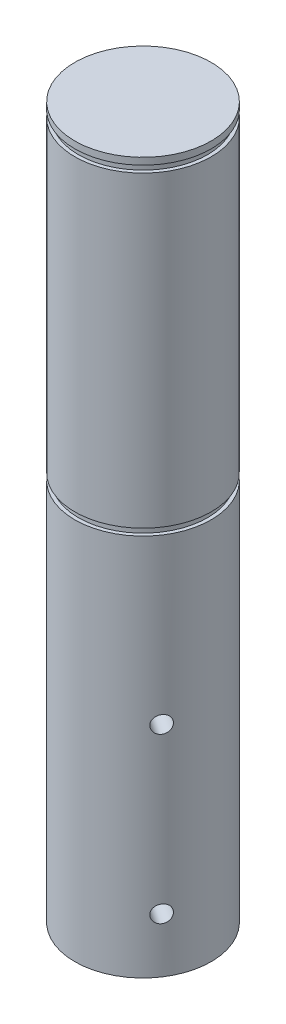
ISO-10303-21;
HEADER;
FILE_DESCRIPTION(('STEP AP214'),'2;1');
FILE_NAME('part.step','',(''),(''),'','','');
FILE_SCHEMA(('AUTOMOTIVE_DESIGN { 1 0 10303 214 1 1 1 1 }'));
ENDSEC;
DATA;
#1=APPLICATION_CONTEXT('core data for automotive mechanical design processes');
#2=APPLICATION_PROTOCOL_DEFINITION('international standard','automotive_design',2000,#1);
#3=PRODUCT_CONTEXT('',#1,'mechanical');
#4=PRODUCT('Part','Part','',(#3));
#5=PRODUCT_RELATED_PRODUCT_CATEGORY('part','',(#4));
#6=PRODUCT_DEFINITION_FORMATION('','',#4);
#7=PRODUCT_DEFINITION_CONTEXT('part definition',#1,'design');
#8=PRODUCT_DEFINITION('design','',#6,#7);
#9=PRODUCT_DEFINITION_SHAPE('','',#8);
#10=(LENGTH_UNIT() NAMED_UNIT(*) SI_UNIT(.MILLI.,.METRE.));
#11=(NAMED_UNIT(*) PLANE_ANGLE_UNIT() SI_UNIT($,.RADIAN.));
#12=(NAMED_UNIT(*) SI_UNIT($,.STERADIAN.) SOLID_ANGLE_UNIT());
#13=UNCERTAINTY_MEASURE_WITH_UNIT(LENGTH_MEASURE(1.E-05),#10,'distance_accuracy_value','');
#14=(GEOMETRIC_REPRESENTATION_CONTEXT(3) GLOBAL_UNCERTAINTY_ASSIGNED_CONTEXT((#13)) GLOBAL_UNIT_ASSIGNED_CONTEXT((#10,
#11,#12)) REPRESENTATION_CONTEXT('',''));
#15=CARTESIAN_POINT('',(0.,0.,0.));
#16=DIRECTION('',(0.,0.,1.));
#17=DIRECTION('',(1.,0.,0.));
#18=AXIS2_PLACEMENT_3D('',#15,#16,#17);
#19=CARTESIAN_POINT('',(5.9,40.,0.));
#20=DIRECTION('',(0.,-1.,0.));
#21=DIRECTION('',(0.,0.,-1.));
#22=AXIS2_PLACEMENT_3D('',#19,#20,#21);
#23=CYLINDRICAL_SURFACE('',#22,9.975);
#24=CARTESIAN_POINT('',(14.8208800148696,32.,4.46301745014509));
#25=CARTESIAN_POINT('',(14.8208791993844,31.9300833414179,4.46302047980772));
#26=CARTESIAN_POINT('',(14.8182302361782,31.8601230204867,4.46832614348333));
#27=CARTESIAN_POINT('',(14.8076533375949,31.7221494896786,4.48937305059214));
#28=CARTESIAN_POINT('',(14.7997198900633,31.6541383903444,4.50512519048948));
#29=CARTESIAN_POINT('',(14.7786586752671,31.5220809048803,4.54649099625896));
#30=CARTESIAN_POINT('',(14.7655344385593,31.4580318580989,4.57209795897621));
#31=CARTESIAN_POINT('',(14.7342392393183,31.3356510610332,4.63227663978951));
#32=CARTESIAN_POINT('',(14.7160691375806,31.2773183378714,4.66684682874429));
#33=CARTESIAN_POINT('',(14.6748010507614,31.1676860877441,4.74398660986875));
#34=CARTESIAN_POINT('',(14.6516787721996,31.1164233589458,4.78659550946792));
#35=CARTESIAN_POINT('',(14.6008923918793,31.0227041303424,4.8783028224304));
#36=CARTESIAN_POINT('',(14.5732280640231,30.9802480691608,4.92740155882611));
#37=CARTESIAN_POINT('',(14.513726980632,30.9052153336054,5.03069491021766));
#38=CARTESIAN_POINT('',(14.4818766623047,30.8726719656389,5.08490592059227));
#39=CARTESIAN_POINT('',(14.4147168090643,30.8186017408368,5.1965818937331));
#40=CARTESIAN_POINT('',(14.3794074032142,30.7970744731625,5.25404673506092));
#41=CARTESIAN_POINT('',(14.3063491094891,30.7657574838292,5.37015804219123));
#42=CARTESIAN_POINT('',(14.2686140392421,30.7559065813251,5.42879669699895));
#43=CARTESIAN_POINT('',(14.1915345026907,30.7480323410411,5.54580810503642));
#44=CARTESIAN_POINT('',(14.1521901000596,30.7500085357699,5.60418086868482));
#45=CARTESIAN_POINT('',(14.073262501895,30.7656833698157,5.71867243562648));
#46=CARTESIAN_POINT('',(14.0336818827281,30.7793162101421,5.77480204296756));
#47=CARTESIAN_POINT('',(13.9552979165347,30.8178144869098,5.88364695592406));
#48=CARTESIAN_POINT('',(13.9164945843622,30.8426801377962,5.93636219633394));
#49=CARTESIAN_POINT('',(13.8408474144264,30.903008133759,6.03718098798724));
#50=CARTESIAN_POINT('',(13.8040091577055,30.9384989449637,6.08527168637536));
#51=CARTESIAN_POINT('',(13.7336909453828,31.0190490982288,6.1755315282443));
#52=CARTESIAN_POINT('',(13.7002111446756,31.0641088813192,6.21770039864174));
#53=CARTESIAN_POINT('',(13.6376201129833,31.1628864004973,6.29542471065586));
#54=CARTESIAN_POINT('',(13.6085404691477,31.2166614816039,6.33093273532519));
#55=CARTESIAN_POINT('',(13.5561566033364,31.3311461501859,6.39418352642242));
#56=CARTESIAN_POINT('',(13.5328523996282,31.3918557595943,6.42192626828889));
#57=CARTESIAN_POINT('',(13.4929574291406,31.5185370312003,6.46904790213366));
#58=CARTESIAN_POINT('',(13.4763695399485,31.5845109344103,6.48842320934279));
#59=CARTESIAN_POINT('',(13.4506253344829,31.7198215917879,6.5183644831425));
#60=CARTESIAN_POINT('',(13.4414686581993,31.7891581828753,6.52893087648737));
#61=CARTESIAN_POINT('',(13.4310206446281,31.9287227652017,6.54097984256913));
#62=CARTESIAN_POINT('',(13.4296764111407,31.9989415277933,6.54252350647777));
#63=CARTESIAN_POINT('',(13.4347700841093,32.1387182250505,6.53665658257985));
#64=CARTESIAN_POINT('',(13.4412078238393,32.2082761738416,6.52924618661072));
#65=CARTESIAN_POINT('',(13.4615513137661,32.3445163480421,6.50567485092267));
#66=CARTESIAN_POINT('',(13.4754316751411,32.4112075222375,6.48954365869661));
#67=CARTESIAN_POINT('',(13.5100610922478,32.5401010131235,6.44889942451443));
#68=CARTESIAN_POINT('',(13.5308103904512,32.6023031712586,6.42438608666971));
#69=CARTESIAN_POINT('',(13.5784646689827,32.7208156946304,6.36735332352047));
#70=CARTESIAN_POINT('',(13.6054017314318,32.7770930421168,6.33479210252232));
#71=CARTESIAN_POINT('',(13.6643162510314,32.8818215184391,6.26244273476337));
#72=CARTESIAN_POINT('',(13.6962939052382,32.9302723411557,6.22265430545356));
#73=CARTESIAN_POINT('',(13.7642897817733,33.0182541864652,6.13649690382621));
#74=CARTESIAN_POINT('',(13.8003301048064,33.0577325125455,6.09009153441971));
#75=CARTESIAN_POINT('',(13.8749988187086,33.1262840624968,5.99197913132436));
#76=CARTESIAN_POINT('',(13.9136271571691,33.1553574969964,5.94027220498347));
#77=CARTESIAN_POINT('',(13.992035749931,33.2021869895519,5.83300781272822));
#78=CARTESIAN_POINT('',(14.0318126013097,33.2199734840143,5.77746115405297));
#79=CARTESIAN_POINT('',(14.1113271880816,33.2438232085716,5.66387975621307));
#80=CARTESIAN_POINT('',(14.1510649251663,33.2498869701024,5.60584512995935));
#81=CARTESIAN_POINT('',(14.2290333708309,33.2501091344703,5.48932682533169));
#82=CARTESIAN_POINT('',(14.2672725364822,33.2443487863141,5.43084894418217));
#83=CARTESIAN_POINT('',(14.3414920601411,33.2212583515877,5.31475167818921));
#84=CARTESIAN_POINT('',(14.3774724197746,33.203928273346,5.25713229272782));
#85=CARTESIAN_POINT('',(14.4462945916468,33.1582158661868,5.14449530773208));
#86=CARTESIAN_POINT('',(14.479137509531,33.1298374487699,5.08947679511937));
#87=CARTESIAN_POINT('',(14.5410144873016,33.0628423428094,4.9836987323979));
#88=CARTESIAN_POINT('',(14.5700485009802,33.0242255300756,4.93293923396016));
#89=CARTESIAN_POINT('',(14.6239691711517,32.9375492979116,4.83694558729285));
#90=CARTESIAN_POINT('',(14.648827286132,32.8894294282882,4.79174998650759));
#91=CARTESIAN_POINT('',(14.6937878582072,32.7852385867877,4.7087317855333));
#92=CARTESIAN_POINT('',(14.7138891875777,32.7291657344704,4.6709109341012));
#93=CARTESIAN_POINT('',(14.749133941208,32.6104109960841,4.60379197271577));
#94=CARTESIAN_POINT('',(14.7642578219954,32.5477043060522,4.57452750758825));
#95=CARTESIAN_POINT('',(14.7892520586603,32.4176726857271,4.52576847346693));
#96=CARTESIAN_POINT('',(14.7991281259017,32.3503528665412,4.5062632844959));
#97=CARTESIAN_POINT('',(14.811176688327,32.2355709802675,4.48237264869644));
#98=CARTESIAN_POINT('',(14.8148131773922,32.1888327428218,4.47512688686462));
#99=CARTESIAN_POINT('',(14.8196651077165,32.0947363502476,4.46544827946795));
#100=CARTESIAN_POINT('',(14.8208805674736,32.0473781998584,4.4630153971299));
#101=CARTESIAN_POINT('',(14.8208800148696,32.,4.46301745014509));
#102=B_SPLINE_CURVE_WITH_KNOTS('',3,(#24,#25,#26,#27,#28,#29,#30,#31,#32,#33,#34,#35,#36,#37,
#38,#39,#40,#41,#42,#43,#44,#45,#46,#47,#48,#49,#50,#51,#52,#53,#54,#55,#56,#57,#58,#59,#60,#61,
#62,#63,#64,#65,#66,#67,#68,#69,#70,#71,#72,#73,#74,#75,#76,#77,#78,#79,#80,#81,#82,#83,#84,#85,
#86,#87,#88,#89,#90,#91,#92,#93,#94,#95,#96,#97,#98,#99,#100,#101),.UNSPECIFIED.,.T.,.F.,(4,2,2,
2,2,2,2,2,2,2,2,2,2,2,2,2,2,2,2,2,2,2,2,2,2,2,2,2,2,2,2,2,2,2,2,2,2,2,4),(0.,0.209576893950373,
0.419372736994426,0.629026130436621,0.838643780169881,1.04931430241201,1.25999531475615,
1.47137659408023,1.68274998949545,1.89301088214847,2.1032634638445,2.31233699613348,
2.52141452000644,2.73105727909714,2.9407097026304,3.1518022182976,3.36289540163882,
3.57407893184075,3.78525223050708,3.9949940437514,4.20473136343457,4.41375772154063,
4.62279145901034,4.83293447881054,5.04308571595898,5.25444101494126,5.46579203516542,
5.67657067602573,5.88733976126652,6.09666540227375,6.30599089259875,6.51524234163157,
6.72449632896824,6.93512696888195,7.14580749456507,7.35730563319072,7.56857311770126,
7.71059151554433,7.85260882828005),.UNSPECIFIED.);
#103=CARTESIAN_POINT('',(14.8208800148696,32.,4.46301745014509));
#104=VERTEX_POINT('',#103);
#105=EDGE_CURVE('E11',#104,#104,#102,.T.);
#106=ORIENTED_EDGE('',*,*,#105,.T.);
#107=EDGE_LOOP('',(#106));
#108=FACE_BOUND('',#107,.T.);
#109=CARTESIAN_POINT('',(14.8208800148696,8.,4.46301745014509));
#110=CARTESIAN_POINT('',(14.8208791993844,7.9300833414179,4.46302047980772));
#111=CARTESIAN_POINT('',(14.8182302361782,7.86012302048667,4.46832614348333));
#112=CARTESIAN_POINT('',(14.8076533375949,7.72214948967865,4.48937305059214));
#113=CARTESIAN_POINT('',(14.7997198900633,7.65413839034441,4.50512519048948));
#114=CARTESIAN_POINT('',(14.7786586752671,7.52208090488033,4.54649099625895));
#115=CARTESIAN_POINT('',(14.7655344385593,7.4580318580989,4.57209795897621));
#116=CARTESIAN_POINT('',(14.7342392393183,7.33565106103318,4.6322766397895));
#117=CARTESIAN_POINT('',(14.7160691375806,7.27731833787137,4.66684682874429));
#118=CARTESIAN_POINT('',(14.6748010507614,7.16768608774415,4.74398660986875));
#119=CARTESIAN_POINT('',(14.6516787721996,7.11642335894578,4.78659550946792));
#120=CARTESIAN_POINT('',(14.6008923918793,7.02270413034242,4.87830282243039));
#121=CARTESIAN_POINT('',(14.5732280640231,6.98024806916079,4.92740155882611));
#122=CARTESIAN_POINT('',(14.513726980632,6.90521533360536,5.03069491021766));
#123=CARTESIAN_POINT('',(14.4818766623047,6.87267196563892,5.08490592059227));
#124=CARTESIAN_POINT('',(14.4147168090643,6.81860174083684,5.19658189373309));
#125=CARTESIAN_POINT('',(14.3794074032142,6.79707447316253,5.25404673506092));
#126=CARTESIAN_POINT('',(14.3063491094891,6.7657574838292,5.37015804219123));
#127=CARTESIAN_POINT('',(14.2686140392421,6.75590658132508,5.42879669699894));
#128=CARTESIAN_POINT('',(14.1915345026907,6.74803234104109,5.54580810503642));
#129=CARTESIAN_POINT('',(14.1521901000596,6.75000853576988,5.60418086868481));
#130=CARTESIAN_POINT('',(14.073262501895,6.76568336981567,5.71867243562647));
#131=CARTESIAN_POINT('',(14.0336818827281,6.77931621014213,5.77480204296756));
#132=CARTESIAN_POINT('',(13.9552979165347,6.81781448690983,5.88364695592406));
#133=CARTESIAN_POINT('',(13.9164945843622,6.84268013779624,5.93636219633394));
#134=CARTESIAN_POINT('',(13.8408474144264,6.90300813375903,6.03718098798724));
#135=CARTESIAN_POINT('',(13.8040091577055,6.93849894496366,6.08527168637536));
#136=CARTESIAN_POINT('',(13.7336909453828,7.01904909822883,6.1755315282443));
#137=CARTESIAN_POINT('',(13.7002111446756,7.06410888131917,6.21770039864174));
#138=CARTESIAN_POINT('',(13.6376201129833,7.16288640049734,6.29542471065586));
#139=CARTESIAN_POINT('',(13.6085404691477,7.21666148160393,6.33093273532519));
#140=CARTESIAN_POINT('',(13.5561566033364,7.33114615018593,6.39418352642242));
#141=CARTESIAN_POINT('',(13.5328523996282,7.39185575959426,6.42192626828889));
#142=CARTESIAN_POINT('',(13.4929574291406,7.5185370312003,6.46904790213366));
#143=CARTESIAN_POINT('',(13.4763695399485,7.58451093441035,6.48842320934279));
#144=CARTESIAN_POINT('',(13.4506253344829,7.71982159178788,6.5183644831425));
#145=CARTESIAN_POINT('',(13.4414686581993,7.78915818287526,6.52893087648737));
#146=CARTESIAN_POINT('',(13.4310206446281,7.92872276520167,6.54097984256913));
#147=CARTESIAN_POINT('',(13.4296764111407,7.99894152779329,6.54252350647777));
#148=CARTESIAN_POINT('',(13.4347700841093,8.13871822505048,6.53665658257985));
#149=CARTESIAN_POINT('',(13.4412078238393,8.20827617384158,6.52924618661072));
#150=CARTESIAN_POINT('',(13.4615513137661,8.34451634804212,6.50567485092267));
#151=CARTESIAN_POINT('',(13.4754316751411,8.41120752223746,6.48954365869661));
#152=CARTESIAN_POINT('',(13.5100610922478,8.54010101312347,6.44889942451443));
#153=CARTESIAN_POINT('',(13.5308103904512,8.60230317125861,6.42438608666971));
#154=CARTESIAN_POINT('',(13.5784646689827,8.72081569463042,6.36735332352048));
#155=CARTESIAN_POINT('',(13.6054017314318,8.77709304211681,6.33479210252232));
#156=CARTESIAN_POINT('',(13.6643162510314,8.88182151843913,6.26244273476337));
#157=CARTESIAN_POINT('',(13.6962939052382,8.93027234115569,6.22265430545356));
#158=CARTESIAN_POINT('',(13.7642897817733,9.01825418646524,6.13649690382621));
#159=CARTESIAN_POINT('',(13.8003301048064,9.05773251254554,6.09009153441971));
#160=CARTESIAN_POINT('',(13.8749988187086,9.12628406249678,5.99197913132437));
#161=CARTESIAN_POINT('',(13.9136271571691,9.15535749699644,5.94027220498348));
#162=CARTESIAN_POINT('',(13.992035749931,9.2021869895519,5.83300781272822));
#163=CARTESIAN_POINT('',(14.0318126013097,9.21997348401435,5.77746115405297));
#164=CARTESIAN_POINT('',(14.1113271880816,9.24382320857161,5.66387975621307));
#165=CARTESIAN_POINT('',(14.1510649251663,9.24988697010239,5.60584512995935));
#166=CARTESIAN_POINT('',(14.2290333708309,9.2501091344703,5.4893268253317));
#167=CARTESIAN_POINT('',(14.2672725364822,9.24434878631406,5.43084894418217));
#168=CARTESIAN_POINT('',(14.3414920601411,9.22125835158772,5.31475167818921));
#169=CARTESIAN_POINT('',(14.3774724197746,9.20392827334604,5.25713229272782));
#170=CARTESIAN_POINT('',(14.4462945916468,9.1582158661868,5.14449530773208));
#171=CARTESIAN_POINT('',(14.479137509531,9.12983744876986,5.08947679511937));
#172=CARTESIAN_POINT('',(14.5410144873016,9.06284234280936,4.9836987323979));
#173=CARTESIAN_POINT('',(14.5700485009802,9.02422553007565,4.93293923396016));
#174=CARTESIAN_POINT('',(14.6239691711517,8.93754929791162,4.83694558729285));
#175=CARTESIAN_POINT('',(14.648827286132,8.88942942828818,4.79174998650759));
#176=CARTESIAN_POINT('',(14.6937878582072,8.78523858678765,4.7087317855333));
#177=CARTESIAN_POINT('',(14.7138891875777,8.72916573447037,4.6709109341012));
#178=CARTESIAN_POINT('',(14.749133941208,8.61041099608409,4.60379197271577));
#179=CARTESIAN_POINT('',(14.7642578219954,8.5477043060522,4.57452750758825));
#180=CARTESIAN_POINT('',(14.7892520586603,8.41767268572709,4.52576847346693));
#181=CARTESIAN_POINT('',(14.7991281259017,8.35035286654118,4.5062632844959));
#182=CARTESIAN_POINT('',(14.811176688327,8.2355709802675,4.48237264869644));
#183=CARTESIAN_POINT('',(14.8148131773922,8.18883274282181,4.47512688686462));
#184=CARTESIAN_POINT('',(14.8196651077165,8.09473635024763,4.46544827946795));
#185=CARTESIAN_POINT('',(14.8208805674736,8.04737819985843,4.4630153971299));
#186=CARTESIAN_POINT('',(14.8208800148696,8.,4.46301745014509));
#187=B_SPLINE_CURVE_WITH_KNOTS('',3,(#109,#110,#111,#112,#113,#114,#115,#116,#117,#118,#119,
#120,#121,#122,#123,#124,#125,#126,#127,#128,#129,#130,#131,#132,#133,#134,#135,#136,#137,#138,
#139,#140,#141,#142,#143,#144,#145,#146,#147,#148,#149,#150,#151,#152,#153,#154,#155,#156,#157,
#158,#159,#160,#161,#162,#163,#164,#165,#166,#167,#168,#169,#170,#171,#172,#173,#174,#175,#176,
#177,#178,#179,#180,#181,#182,#183,#184,#185,#186),.UNSPECIFIED.,.T.,.F.,(4,2,2,2,2,2,2,2,2,2,2,
2,2,2,2,2,2,2,2,2,2,2,2,2,2,2,2,2,2,2,2,2,2,2,2,2,2,2,4),(0.,0.209576893950371,
0.419372736994425,0.629026130436621,0.83864378016988,1.04931430241201,1.25999531475616,
1.47137659408022,1.68274998949545,1.89301088214846,2.1032634638445,2.31233699613348,
2.52141452000644,2.73105727909714,2.9407097026304,3.15180221829761,3.36289540163882,
3.57407893184076,3.78525223050708,3.9949940437514,4.20473136343458,4.41375772154062,
4.62279145901034,4.83293447881054,5.04308571595897,5.25444101494127,5.46579203516542,
5.67657067602574,5.88733976126653,6.09666540227375,6.30599089259876,6.51524234163158,
6.72449632896824,6.93512696888195,7.14580749456507,7.35730563319072,7.56857311770126,
7.71059151554434,7.85260882828005),.UNSPECIFIED.);
#188=CARTESIAN_POINT('',(14.8208800148696,8.,4.46301745014509));
#189=VERTEX_POINT('',#188);
#190=EDGE_CURVE('E49',#189,#189,#187,.T.);
#191=ORIENTED_EDGE('',*,*,#190,.T.);
#192=EDGE_LOOP('',(#191));
#193=FACE_BOUND('',#192,.T.);
#194=CARTESIAN_POINT('',(5.9,0.,0.));
#195=DIRECTION('',(0.,1.,0.));
#196=DIRECTION('',(0.,0.,1.));
#197=AXIS2_PLACEMENT_3D('',#194,#195,#196);
#198=CIRCLE('',#197,9.975);
#199=CARTESIAN_POINT('',(5.9,0.,9.975));
#200=VERTEX_POINT('',#199);
#201=EDGE_CURVE('E69',#200,#200,#198,.T.);
#202=ORIENTED_EDGE('',*,*,#201,.T.);
#203=EDGE_LOOP('',(#202));
#204=FACE_BOUND('',#203,.T.);
#205=CARTESIAN_POINT('',(5.9,56.,0.));
#206=DIRECTION('',(0.,1.,0.));
#207=DIRECTION('',(0.,0.,1.));
#208=AXIS2_PLACEMENT_3D('',#205,#206,#207);
#209=CIRCLE('',#208,9.975);
#210=CARTESIAN_POINT('',(5.9,56.,9.975));
#211=VERTEX_POINT('',#210);
#212=EDGE_CURVE('E66',#211,#211,#209,.T.);
#213=ORIENTED_EDGE('',*,*,#212,.F.);
#214=EDGE_LOOP('',(#213));
#215=FACE_BOUND('',#214,.T.);
#216=ADVANCED_FACE('F38',(#108,#193,#204,#215),#23,.T.);
#217=CARTESIAN_POINT('',(5.9,0.,0.));
#218=DIRECTION('',(0.,1.,0.));
#219=DIRECTION('',(0.,0.,1.));
#220=AXIS2_PLACEMENT_3D('',#217,#218,#219);
#221=PLANE('',#220);
#222=ORIENTED_EDGE('',*,*,#201,.F.);
#223=EDGE_LOOP('',(#222));
#224=FACE_BOUND('',#223,.T.);
#225=ADVANCED_FACE('F86',(#224),#221,.F.);
#226=CARTESIAN_POINT('',(14.1912833233419,8.,5.54574123558536));
#227=DIRECTION('',(0.831206348204706,0.,0.555964033642643));
#228=DIRECTION('',(0.555964033642643,0.,-0.831206348204706));
#229=AXIS2_PLACEMENT_3D('',#226,#227,#228);
#230=CYLINDRICAL_SURFACE('',#229,1.24999999999999);
#231=CARTESIAN_POINT('',(7.12602936360194,8.,0.8200469496229));
#232=DIRECTION('',(0.831206348204706,0.,0.555964033642643));
#233=DIRECTION('',(0.555964033642643,0.,-0.831206348204706));
#234=AXIS2_PLACEMENT_3D('',#231,#232,#233);
#235=CIRCLE('',#234,1.24999999999999);
#236=CARTESIAN_POINT('',(7.82098440565524,8.,-0.218960985632971));
#237=VERTEX_POINT('',#236);
#238=EDGE_CURVE('E65',#237,#237,#235,.T.);
#239=ORIENTED_EDGE('',*,*,#238,.F.);
#240=EDGE_LOOP('',(#239));
#241=FACE_BOUND('',#240,.T.);
#242=ORIENTED_EDGE('',*,*,#190,.F.);
#243=EDGE_LOOP('',(#242));
#244=FACE_BOUND('',#243,.T.);
#245=ADVANCED_FACE('F81',(#241,#244),#230,.F.);
#246=CARTESIAN_POINT('',(7.12602936360194,8.,0.8200469496229));
#247=DIRECTION('',(0.831206348204706,0.,0.555964033642643));
#248=DIRECTION('',(0.555964033642643,0.,-0.831206348204706));
#249=AXIS2_PLACEMENT_3D('',#246,#247,#248);
#250=CONICAL_SURFACE('',#249,1.24999999999999,1.02974425867665);
#251=CARTESIAN_POINT('',(6.50173041244956,8.,0.402475832858432));
#252=VERTEX_POINT('',#251);
#253=VERTEX_LOOP('',#252);
#254=FACE_BOUND('',#253,.T.);
#255=ORIENTED_EDGE('',*,*,#238,.T.);
#256=EDGE_LOOP('',(#255));
#257=FACE_BOUND('',#256,.T.);
#258=ADVANCED_FACE('F85',(#254,#257),#250,.F.);
#259=CARTESIAN_POINT('',(14.1912833233419,32.,5.54574123558536));
#260=DIRECTION('',(0.831206348204706,0.,0.555964033642643));
#261=DIRECTION('',(0.555964033642643,0.,-0.831206348204706));
#262=AXIS2_PLACEMENT_3D('',#259,#260,#261);
#263=CYLINDRICAL_SURFACE('',#262,1.24999999999999);
#264=CARTESIAN_POINT('',(7.12602936360194,32.,0.8200469496229));
#265=DIRECTION('',(0.831206348204706,0.,0.555964033642643));
#266=DIRECTION('',(0.555964033642643,0.,-0.831206348204706));
#267=AXIS2_PLACEMENT_3D('',#264,#265,#266);
#268=CIRCLE('',#267,1.24999999999999);
#269=CARTESIAN_POINT('',(7.82098440565524,32.,-0.218960985632971));
#270=VERTEX_POINT('',#269);
#271=EDGE_CURVE('E63',#270,#270,#268,.T.);
#272=ORIENTED_EDGE('',*,*,#271,.F.);
#273=EDGE_LOOP('',(#272));
#274=FACE_BOUND('',#273,.T.);
#275=ORIENTED_EDGE('',*,*,#105,.F.);
#276=EDGE_LOOP('',(#275));
#277=FACE_BOUND('',#276,.T.);
#278=ADVANCED_FACE('F59',(#274,#277),#263,.F.);
#279=CARTESIAN_POINT('',(7.12602936360194,32.,0.8200469496229));
#280=DIRECTION('',(0.831206348204706,0.,0.555964033642643));
#281=DIRECTION('',(0.555964033642643,0.,-0.831206348204706));
#282=AXIS2_PLACEMENT_3D('',#279,#280,#281);
#283=CONICAL_SURFACE('',#282,1.24999999999999,1.02974425867665);
#284=CARTESIAN_POINT('',(6.50173041244956,32.,0.402475832858432));
#285=VERTEX_POINT('',#284);
#286=VERTEX_LOOP('',#285);
#287=FACE_BOUND('',#286,.T.);
#288=ORIENTED_EDGE('',*,*,#271,.T.);
#289=EDGE_LOOP('',(#288));
#290=FACE_BOUND('',#289,.T.);
#291=ADVANCED_FACE('F55',(#287,#290),#283,.F.);
#292=CARTESIAN_POINT('',(5.9,56.,0.));
#293=DIRECTION('',(0.,1.,0.));
#294=DIRECTION('',(0.,0.,1.));
#295=AXIS2_PLACEMENT_3D('',#292,#293,#294);
#296=PLANE('',#295);
#297=CARTESIAN_POINT('',(5.9,56.,0.));
#298=DIRECTION('',(0.,1.,0.));
#299=DIRECTION('',(0.,0.,1.));
#300=AXIS2_PLACEMENT_3D('',#297,#298,#299);
#301=CIRCLE('',#300,9.45);
#302=CARTESIAN_POINT('',(5.9,56.,9.45));
#303=VERTEX_POINT('',#302);
#304=EDGE_CURVE('E241',#303,#303,#301,.T.);
#305=ORIENTED_EDGE('',*,*,#304,.F.);
#306=EDGE_LOOP('',(#305));
#307=FACE_BOUND('',#306,.T.);
#308=ORIENTED_EDGE('',*,*,#212,.T.);
#309=EDGE_LOOP('',(#308));
#310=FACE_BOUND('',#309,.T.);
#311=ADVANCED_FACE('F58',(#307,#310),#296,.T.);
#312=CARTESIAN_POINT('',(5.9,57.,0.));
#313=DIRECTION('',(0.,-1.,0.));
#314=DIRECTION('',(0.,0.,-1.));
#315=AXIS2_PLACEMENT_3D('',#312,#313,#314);
#316=CYLINDRICAL_SURFACE('',#315,9.45);
#317=CARTESIAN_POINT('',(5.9,57.,0.));
#318=DIRECTION('',(0.,1.,0.));
#319=DIRECTION('',(0.,0.,1.));
#320=AXIS2_PLACEMENT_3D('',#317,#318,#319);
#321=CIRCLE('',#320,9.45);
#322=CARTESIAN_POINT('',(5.9,57.,9.45));
#323=VERTEX_POINT('',#322);
#324=EDGE_CURVE('E72',#323,#323,#321,.T.);
#325=ORIENTED_EDGE('',*,*,#324,.F.);
#326=EDGE_LOOP('',(#325));
#327=FACE_BOUND('',#326,.T.);
#328=ORIENTED_EDGE('',*,*,#304,.T.);
#329=EDGE_LOOP('',(#328));
#330=FACE_BOUND('',#329,.T.);
#331=ADVANCED_FACE('F101',(#327,#330),#316,.T.);
#332=CARTESIAN_POINT('',(5.9,102.,0.));
#333=DIRECTION('',(0.,-1.,0.));
#334=DIRECTION('',(0.,0.,-1.));
#335=AXIS2_PLACEMENT_3D('',#332,#333,#334);
#336=CYLINDRICAL_SURFACE('',#335,9.975);
#337=CARTESIAN_POINT('',(5.9,102.,0.));
#338=DIRECTION('',(0.,1.,0.));
#339=DIRECTION('',(0.,0.,1.));
#340=AXIS2_PLACEMENT_3D('',#337,#338,#339);
#341=CIRCLE('',#340,9.975);
#342=CARTESIAN_POINT('',(5.9,102.,-9.975));
#343=VERTEX_POINT('',#342);
#344=EDGE_CURVE('E238',#343,#343,#341,.T.);
#345=CARTESIAN_POINT('',(5.9,57.,0.));
#346=DIRECTION('',(0.,1.,0.));
#347=DIRECTION('',(0.,0.,1.));
#348=AXIS2_PLACEMENT_3D('',#345,#346,#347);
#349=CIRCLE('',#348,9.975);
#350=CARTESIAN_POINT('',(5.9,57.,-9.975));
#351=VERTEX_POINT('',#350);
#352=EDGE_CURVE('E235',#351,#351,#349,.T.);
#353=CARTESIAN_POINT('',(5.9,102.,-9.975));
#354=CARTESIAN_POINT('',(5.9,101.53125,-9.975));
#355=CARTESIAN_POINT('',(5.9,101.0625,-9.975));
#356=CARTESIAN_POINT('',(5.9,100.125,-9.975));
#357=CARTESIAN_POINT('',(5.9,99.65625,-9.975));
#358=CARTESIAN_POINT('',(5.9,98.71875,-9.975));
#359=CARTESIAN_POINT('',(5.9,98.25,-9.975));
#360=CARTESIAN_POINT('',(5.9,97.3125,-9.975));
#361=CARTESIAN_POINT('',(5.9,96.84375,-9.975));
#362=CARTESIAN_POINT('',(5.9,95.90625,-9.975));
#363=CARTESIAN_POINT('',(5.9,95.4375,-9.975));
#364=CARTESIAN_POINT('',(5.9,94.5,-9.975));
#365=CARTESIAN_POINT('',(5.9,94.03125,-9.975));
#366=CARTESIAN_POINT('',(5.9,93.09375,-9.975));
#367=CARTESIAN_POINT('',(5.9,92.625,-9.975));
#368=CARTESIAN_POINT('',(5.9,91.6875,-9.975));
#369=CARTESIAN_POINT('',(5.9,91.21875,-9.975));
#370=CARTESIAN_POINT('',(5.9,90.28125,-9.975));
#371=CARTESIAN_POINT('',(5.9,89.8125,-9.975));
#372=CARTESIAN_POINT('',(5.9,88.875,-9.975));
#373=CARTESIAN_POINT('',(5.9,88.40625,-9.975));
#374=CARTESIAN_POINT('',(5.9,87.46875,-9.975));
#375=CARTESIAN_POINT('',(5.9,87.,-9.975));
#376=CARTESIAN_POINT('',(5.9,86.0625,-9.975));
#377=CARTESIAN_POINT('',(5.9,85.59375,-9.975));
#378=CARTESIAN_POINT('',(5.9,84.65625,-9.975));
#379=CARTESIAN_POINT('',(5.9,84.1875,-9.975));
#380=CARTESIAN_POINT('',(5.9,83.25,-9.975));
#381=CARTESIAN_POINT('',(5.9,82.78125,-9.975));
#382=CARTESIAN_POINT('',(5.9,81.84375,-9.975));
#383=CARTESIAN_POINT('',(5.9,81.375,-9.975));
#384=CARTESIAN_POINT('',(5.9,80.4375,-9.975));
#385=CARTESIAN_POINT('',(5.9,79.96875,-9.975));
#386=CARTESIAN_POINT('',(5.9,79.03125,-9.975));
#387=CARTESIAN_POINT('',(5.9,78.5625,-9.975));
#388=CARTESIAN_POINT('',(5.9,77.625,-9.975));
#389=CARTESIAN_POINT('',(5.9,77.15625,-9.975));
#390=CARTESIAN_POINT('',(5.9,76.21875,-9.975));
#391=CARTESIAN_POINT('',(5.9,75.75,-9.975));
#392=CARTESIAN_POINT('',(5.9,74.8125,-9.975));
#393=CARTESIAN_POINT('',(5.9,74.34375,-9.975));
#394=CARTESIAN_POINT('',(5.9,73.40625,-9.975));
#395=CARTESIAN_POINT('',(5.9,72.9375,-9.975));
#396=CARTESIAN_POINT('',(5.9,72.,-9.975));
#397=CARTESIAN_POINT('',(5.9,71.53125,-9.975));
#398=CARTESIAN_POINT('',(5.9,70.59375,-9.975));
#399=CARTESIAN_POINT('',(5.9,70.125,-9.975));
#400=CARTESIAN_POINT('',(5.9,69.1875,-9.975));
#401=CARTESIAN_POINT('',(5.9,68.71875,-9.975));
#402=CARTESIAN_POINT('',(5.9,67.78125,-9.975));
#403=CARTESIAN_POINT('',(5.9,67.3125,-9.975));
#404=CARTESIAN_POINT('',(5.9,66.375,-9.975));
#405=CARTESIAN_POINT('',(5.9,65.90625,-9.975));
#406=CARTESIAN_POINT('',(5.9,64.96875,-9.975));
#407=CARTESIAN_POINT('',(5.9,64.5,-9.975));
#408=CARTESIAN_POINT('',(5.9,63.5625,-9.975));
#409=CARTESIAN_POINT('',(5.9,63.09375,-9.975));
#410=CARTESIAN_POINT('',(5.9,62.15625,-9.975));
#411=CARTESIAN_POINT('',(5.9,61.6875,-9.975));
#412=CARTESIAN_POINT('',(5.9,60.75,-9.975));
#413=CARTESIAN_POINT('',(5.9,60.28125,-9.975));
#414=CARTESIAN_POINT('',(5.9,59.34375,-9.975));
#415=CARTESIAN_POINT('',(5.9,58.875,-9.975));
#416=CARTESIAN_POINT('',(5.9,57.9375,-9.975));
#417=CARTESIAN_POINT('',(5.9,57.46875,-9.975));
#418=CARTESIAN_POINT('',(5.9,57.,-9.975));
#419=B_SPLINE_CURVE_WITH_KNOTS('',3,(#353,#354,#355,#356,#357,#358,#359,#360,#361,#362,#363,
#364,#365,#366,#367,#368,#369,#370,#371,#372,#373,#374,#375,#376,#377,#378,#379,#380,#381,#382,
#383,#384,#385,#386,#387,#388,#389,#390,#391,#392,#393,#394,#395,#396,#397,#398,#399,#400,#401,
#402,#403,#404,#405,#406,#407,#408,#409,#410,#411,#412,#413,#414,#415,#416,#417,#418),
.UNSPECIFIED.,.F.,.F.,(4,2,2,2,2,2,2,2,2,2,2,2,2,2,2,2,2,2,2,2,2,2,2,2,2,2,2,2,2,2,2,2,4),(0.,
1.40625,2.8125,4.21874999999999,5.62499999999999,7.03124999999999,8.43749999999999,9.84375,
11.25,12.65625,14.0625,15.46875,16.875,18.28125,19.6875,21.09375,22.5,23.90625,25.3125,26.71875,
28.125,29.53125,30.9375,32.34375,33.75,35.15625,36.5625,37.96875,39.375,40.78125,42.1875,
43.59375,45.),.UNSPECIFIED.);
#420=EDGE_CURVE('BSEAM107',#343,#351,#419,.T.);
#421=ORIENTED_EDGE('',*,*,#344,.F.);
#422=ORIENTED_EDGE('',*,*,#352,.T.);
#423=ORIENTED_EDGE('',*,*,#420,.T.);
#424=ORIENTED_EDGE('',*,*,#420,.F.);
#425=EDGE_LOOP('',(#421,#423,#422,#424));
#426=FACE_BOUND('',#425,.T.);
#427=ADVANCED_FACE('F107',(#426),#336,.T.);
#428=CARTESIAN_POINT('',(5.9,102.,0.));
#429=DIRECTION('',(0.,1.,0.));
#430=DIRECTION('',(0.,0.,1.));
#431=AXIS2_PLACEMENT_3D('',#428,#429,#430);
#432=PLANE('',#431);
#433=CARTESIAN_POINT('',(5.9,102.,0.));
#434=DIRECTION('',(0.,1.,0.));
#435=DIRECTION('',(0.,0.,1.));
#436=AXIS2_PLACEMENT_3D('',#433,#434,#435);
#437=CIRCLE('',#436,9.45);
#438=CARTESIAN_POINT('',(5.9,102.,9.45));
#439=VERTEX_POINT('',#438);
#440=EDGE_CURVE('E231',#439,#439,#437,.T.);
#441=ORIENTED_EDGE('',*,*,#440,.F.);
#442=EDGE_LOOP('',(#441));
#443=FACE_BOUND('',#442,.T.);
#444=ORIENTED_EDGE('',*,*,#344,.T.);
#445=EDGE_LOOP('',(#444));
#446=FACE_BOUND('',#445,.T.);
#447=ADVANCED_FACE('F157',(#443,#446),#432,.T.);
#448=CARTESIAN_POINT('',(5.9,57.,0.));
#449=DIRECTION('',(0.,1.,0.));
#450=DIRECTION('',(0.,0.,1.));
#451=AXIS2_PLACEMENT_3D('',#448,#449,#450);
#452=PLANE('',#451);
#453=ORIENTED_EDGE('',*,*,#324,.T.);
#454=EDGE_LOOP('',(#453));
#455=FACE_BOUND('',#454,.T.);
#456=ORIENTED_EDGE('',*,*,#352,.F.);
#457=EDGE_LOOP('',(#456));
#458=FACE_BOUND('',#457,.T.);
#459=ADVANCED_FACE('F164',(#455,#458),#452,.F.);
#460=CARTESIAN_POINT('',(5.9,103.,0.));
#461=DIRECTION('',(0.,-1.,0.));
#462=DIRECTION('',(0.,0.,-1.));
#463=AXIS2_PLACEMENT_3D('',#460,#461,#462);
#464=CYLINDRICAL_SURFACE('',#463,9.45);
#465=CARTESIAN_POINT('',(5.9,103.,0.));
#466=DIRECTION('',(0.,1.,0.));
#467=DIRECTION('',(0.,0.,1.));
#468=AXIS2_PLACEMENT_3D('',#465,#466,#467);
#469=CIRCLE('',#468,9.45);
#470=CARTESIAN_POINT('',(5.9,103.,9.45));
#471=VERTEX_POINT('',#470);
#472=EDGE_CURVE('E223',#471,#471,#469,.T.);
#473=ORIENTED_EDGE('',*,*,#472,.F.);
#474=EDGE_LOOP('',(#473));
#475=FACE_BOUND('',#474,.T.);
#476=ORIENTED_EDGE('',*,*,#440,.T.);
#477=EDGE_LOOP('',(#476));
#478=FACE_BOUND('',#477,.T.);
#479=ADVANCED_FACE('F169',(#475,#478),#464,.T.);
#480=CARTESIAN_POINT('',(5.9,104.,0.));
#481=DIRECTION('',(0.,-1.,0.));
#482=DIRECTION('',(0.,0.,-1.));
#483=AXIS2_PLACEMENT_3D('',#480,#481,#482);
#484=CYLINDRICAL_SURFACE('',#483,9.975);
#485=CARTESIAN_POINT('',(5.9,104.,0.));
#486=DIRECTION('',(0.,1.,0.));
#487=DIRECTION('',(0.,0.,1.));
#488=AXIS2_PLACEMENT_3D('',#485,#486,#487);
#489=CIRCLE('',#488,9.975);
#490=CARTESIAN_POINT('',(5.9,104.,9.975));
#491=VERTEX_POINT('',#490);
#492=EDGE_CURVE('E228',#491,#491,#489,.T.);
#493=ORIENTED_EDGE('',*,*,#492,.F.);
#494=EDGE_LOOP('',(#493));
#495=FACE_BOUND('',#494,.T.);
#496=CARTESIAN_POINT('',(5.9,103.,0.));
#497=DIRECTION('',(0.,1.,0.));
#498=DIRECTION('',(0.,0.,1.));
#499=AXIS2_PLACEMENT_3D('',#496,#497,#498);
#500=CIRCLE('',#499,9.975);
#501=CARTESIAN_POINT('',(5.9,103.,9.975));
#502=VERTEX_POINT('',#501);
#503=EDGE_CURVE('E226',#502,#502,#500,.T.);
#504=ORIENTED_EDGE('',*,*,#503,.T.);
#505=EDGE_LOOP('',(#504));
#506=FACE_BOUND('',#505,.T.);
#507=ADVANCED_FACE('F186',(#495,#506),#484,.T.);
#508=CARTESIAN_POINT('',(5.9,104.,0.));
#509=DIRECTION('',(0.,1.,0.));
#510=DIRECTION('',(0.,0.,1.));
#511=AXIS2_PLACEMENT_3D('',#508,#509,#510);
#512=PLANE('',#511);
#513=ORIENTED_EDGE('',*,*,#492,.T.);
#514=EDGE_LOOP('',(#513));
#515=FACE_BOUND('',#514,.T.);
#516=ADVANCED_FACE('F196',(#515),#512,.T.);
#517=CARTESIAN_POINT('',(5.9,103.,0.));
#518=DIRECTION('',(0.,1.,0.));
#519=DIRECTION('',(0.,0.,1.));
#520=AXIS2_PLACEMENT_3D('',#517,#518,#519);
#521=PLANE('',#520);
#522=ORIENTED_EDGE('',*,*,#472,.T.);
#523=EDGE_LOOP('',(#522));
#524=FACE_BOUND('',#523,.T.);
#525=ORIENTED_EDGE('',*,*,#503,.F.);
#526=EDGE_LOOP('',(#525));
#527=FACE_BOUND('',#526,.T.);
#528=ADVANCED_FACE('F206',(#524,#527),#521,.F.);
#529=CLOSED_SHELL('',(#216,#225,#245,#258,#278,#291,#311,#331,#427,#447,#459,#479,#507,#516,#528));
#530=MANIFOLD_SOLID_BREP('B2',#529);
#531=ADVANCED_BREP_SHAPE_REPRESENTATION('',(#18,#530),#14);
#532=SHAPE_DEFINITION_REPRESENTATION(#9,#531);
ENDSEC;
END-ISO-10303-21;
